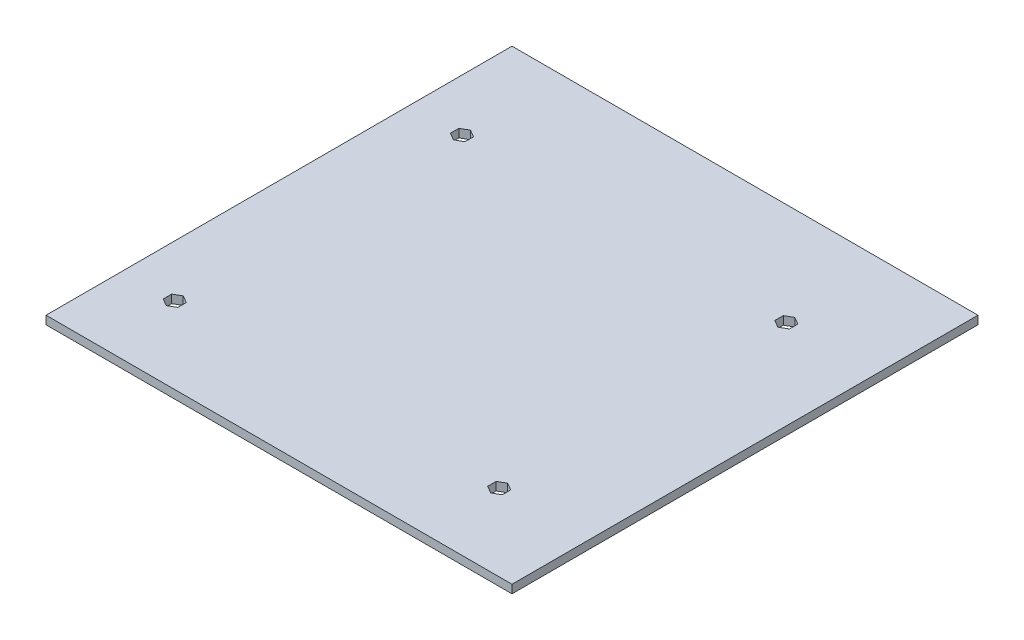
ISO-10303-21;
HEADER;
FILE_DESCRIPTION(('STEP AP214'),'2;1');
FILE_NAME('part.step','',(''),(''),'','','');
FILE_SCHEMA(('AUTOMOTIVE_DESIGN { 1 0 10303 214 1 1 1 1 }'));
ENDSEC;
DATA;
#1=APPLICATION_CONTEXT('core data for automotive mechanical design processes');
#2=APPLICATION_PROTOCOL_DEFINITION('international standard','automotive_design',2000,#1);
#3=PRODUCT_CONTEXT('',#1,'mechanical');
#4=PRODUCT('Part','Part','',(#3));
#5=PRODUCT_RELATED_PRODUCT_CATEGORY('part','',(#4));
#6=PRODUCT_DEFINITION_FORMATION('','',#4);
#7=PRODUCT_DEFINITION_CONTEXT('part definition',#1,'design');
#8=PRODUCT_DEFINITION('design','',#6,#7);
#9=PRODUCT_DEFINITION_SHAPE('','',#8);
#10=(LENGTH_UNIT() NAMED_UNIT(*) SI_UNIT(.MILLI.,.METRE.));
#11=(NAMED_UNIT(*) PLANE_ANGLE_UNIT() SI_UNIT($,.RADIAN.));
#12=(NAMED_UNIT(*) SI_UNIT($,.STERADIAN.) SOLID_ANGLE_UNIT());
#13=UNCERTAINTY_MEASURE_WITH_UNIT(LENGTH_MEASURE(1.E-05),#10,'distance_accuracy_value','');
#14=(GEOMETRIC_REPRESENTATION_CONTEXT(3) GLOBAL_UNCERTAINTY_ASSIGNED_CONTEXT((#13)) GLOBAL_UNIT_ASSIGNED_CONTEXT((#10,
#11,#12)) REPRESENTATION_CONTEXT('',''));
#15=CARTESIAN_POINT('',(0.,0.,0.));
#16=DIRECTION('',(0.,0.,1.));
#17=DIRECTION('',(1.,0.,0.));
#18=AXIS2_PLACEMENT_3D('',#15,#16,#17);
#19=CARTESIAN_POINT('',(-75.972706935123,3.175,110.776957494407));
#20=DIRECTION('',(1.,0.,0.));
#21=DIRECTION('',(0.,0.,-1.));
#22=AXIS2_PLACEMENT_3D('',#19,#20,#21);
#23=PLANE('',#22);
#24=DIRECTION('',(0.,0.,1.));
#25=VECTOR('',#24,1.);
#26=CARTESIAN_POINT('',(-75.972706935123,0.,110.776957494407));
#27=LINE('',#26,#25);
#28=CARTESIAN_POINT('',(-75.972706935123,0.,-67.0230425055928));
#29=VERTEX_POINT('',#28);
#30=CARTESIAN_POINT('',(-75.972706935123,0.,110.776957494407));
#31=VERTEX_POINT('',#30);
#32=EDGE_CURVE('E479',#29,#31,#27,.T.);
#33=ORIENTED_EDGE('',*,*,#32,.T.);
#34=DIRECTION('',(0.,-1.,0.));
#35=VECTOR('',#34,1.);
#36=CARTESIAN_POINT('',(-75.972706935123,3.175,110.776957494407));
#37=LINE('',#36,#35);
#38=CARTESIAN_POINT('',(-75.972706935123,3.175,110.776957494407));
#39=VERTEX_POINT('',#38);
#40=EDGE_CURVE('E11',#39,#31,#37,.T.);
#41=ORIENTED_EDGE('',*,*,#40,.F.);
#42=DIRECTION('',(0.,0.,1.));
#43=VECTOR('',#42,1.);
#44=CARTESIAN_POINT('',(-75.972706935123,3.175,110.776957494407));
#45=LINE('',#44,#43);
#46=CARTESIAN_POINT('',(-75.972706935123,3.175,-67.0230425055928));
#47=VERTEX_POINT('',#46);
#48=EDGE_CURVE('E495',#47,#39,#45,.T.);
#49=ORIENTED_EDGE('',*,*,#48,.F.);
#50=DIRECTION('',(0.,-1.,0.));
#51=VECTOR('',#50,1.);
#52=CARTESIAN_POINT('',(-75.972706935123,3.175,-67.0230425055928));
#53=LINE('',#52,#51);
#54=EDGE_CURVE('E509',#47,#29,#53,.T.);
#55=ORIENTED_EDGE('',*,*,#54,.T.);
#56=EDGE_LOOP('',(#33,#41,#49,#55));
#57=FACE_BOUND('',#56,.T.);
#58=ADVANCED_FACE('F38',(#57),#23,.F.);
#59=CARTESIAN_POINT('',(-75.972706935123,3.175,110.776957494407));
#60=DIRECTION('',(0.,0.,-1.));
#61=DIRECTION('',(-1.,0.,0.));
#62=AXIS2_PLACEMENT_3D('',#59,#60,#61);
#63=PLANE('',#62);
#64=DIRECTION('',(1.,0.,0.));
#65=VECTOR('',#64,1.);
#66=CARTESIAN_POINT('',(-75.972706935123,0.,110.776957494407));
#67=LINE('',#66,#65);
#68=CARTESIAN_POINT('',(101.827293064877,0.,110.776957494407));
#69=VERTEX_POINT('',#68);
#70=EDGE_CURVE('E513',#31,#69,#67,.T.);
#71=ORIENTED_EDGE('',*,*,#70,.T.);
#72=DIRECTION('',(0.,-1.,0.));
#73=VECTOR('',#72,1.);
#74=CARTESIAN_POINT('',(101.827293064877,3.175,110.776957494407));
#75=LINE('',#74,#73);
#76=CARTESIAN_POINT('',(101.827293064877,3.175,110.776957494407));
#77=VERTEX_POINT('',#76);
#78=EDGE_CURVE('E46',#77,#69,#75,.T.);
#79=ORIENTED_EDGE('',*,*,#78,.F.);
#80=DIRECTION('',(1.,0.,0.));
#81=VECTOR('',#80,1.);
#82=CARTESIAN_POINT('',(-75.972706935123,3.175,110.776957494407));
#83=LINE('',#82,#81);
#84=EDGE_CURVE('E499',#39,#77,#83,.T.);
#85=ORIENTED_EDGE('',*,*,#84,.F.);
#86=ORIENTED_EDGE('',*,*,#40,.T.);
#87=EDGE_LOOP('',(#71,#79,#85,#86));
#88=FACE_BOUND('',#87,.T.);
#89=ADVANCED_FACE('F548',(#88),#63,.F.);
#90=CARTESIAN_POINT('',(101.827293064877,3.175,110.776957494407));
#91=DIRECTION('',(-1.,0.,0.));
#92=DIRECTION('',(0.,0.,1.));
#93=AXIS2_PLACEMENT_3D('',#90,#91,#92);
#94=PLANE('',#93);
#95=DIRECTION('',(0.,0.,-1.));
#96=VECTOR('',#95,1.);
#97=CARTESIAN_POINT('',(101.827293064877,0.,110.776957494407));
#98=LINE('',#97,#96);
#99=CARTESIAN_POINT('',(101.827293064877,0.,-67.0230425055928));
#100=VERTEX_POINT('',#99);
#101=EDGE_CURVE('E516',#69,#100,#98,.T.);
#102=ORIENTED_EDGE('',*,*,#101,.T.);
#103=DIRECTION('',(0.,-1.,0.));
#104=VECTOR('',#103,1.);
#105=CARTESIAN_POINT('',(101.827293064877,3.175,-67.0230425055928));
#106=LINE('',#105,#104);
#107=CARTESIAN_POINT('',(101.827293064877,3.175,-67.0230425055928));
#108=VERTEX_POINT('',#107);
#109=EDGE_CURVE('E524',#108,#100,#106,.T.);
#110=ORIENTED_EDGE('',*,*,#109,.F.);
#111=DIRECTION('',(0.,0.,-1.));
#112=VECTOR('',#111,1.);
#113=CARTESIAN_POINT('',(101.827293064877,3.175,110.776957494407));
#114=LINE('',#113,#112);
#115=EDGE_CURVE('E503',#77,#108,#114,.T.);
#116=ORIENTED_EDGE('',*,*,#115,.F.);
#117=ORIENTED_EDGE('',*,*,#78,.T.);
#118=EDGE_LOOP('',(#102,#110,#116,#117));
#119=FACE_BOUND('',#118,.T.);
#120=ADVANCED_FACE('F533',(#119),#94,.F.);
#121=CARTESIAN_POINT('',(-75.972706935123,3.175,-67.0230425055928));
#122=DIRECTION('',(0.,0.,1.));
#123=DIRECTION('',(1.,0.,0.));
#124=AXIS2_PLACEMENT_3D('',#121,#122,#123);
#125=PLANE('',#124);
#126=DIRECTION('',(-1.,0.,0.));
#127=VECTOR('',#126,1.);
#128=CARTESIAN_POINT('',(-75.972706935123,0.,-67.0230425055928));
#129=LINE('',#128,#127);
#130=EDGE_CURVE('E500',#100,#29,#129,.T.);
#131=ORIENTED_EDGE('',*,*,#130,.T.);
#132=ORIENTED_EDGE('',*,*,#54,.F.);
#133=DIRECTION('',(-1.,0.,0.));
#134=VECTOR('',#133,1.);
#135=CARTESIAN_POINT('',(-75.972706935123,3.175,-67.0230425055928));
#136=LINE('',#135,#134);
#137=EDGE_CURVE('E506',#108,#47,#136,.T.);
#138=ORIENTED_EDGE('',*,*,#137,.F.);
#139=ORIENTED_EDGE('',*,*,#109,.T.);
#140=EDGE_LOOP('',(#131,#132,#138,#139));
#141=FACE_BOUND('',#140,.T.);
#142=ADVANCED_FACE('F541',(#141),#125,.F.);
#143=CARTESIAN_POINT('',(0.,3.175,0.));
#144=DIRECTION('',(0.,-1.,0.));
#145=DIRECTION('',(0.,0.,-1.));
#146=AXIS2_PLACEMENT_3D('',#143,#144,#145);
#147=PLANE('',#146);
#148=DIRECTION('',(-0.866025403784439,0.,0.5));
#149=VECTOR('',#148,1.);
#150=CARTESIAN_POINT('',(67.6104569627221,3.175,-31.3426112365452));
#151=LINE('',#150,#149);
#152=CARTESIAN_POINT('',(67.6104569627221,3.175,-31.3426112365452));
#153=VERTEX_POINT('',#152);
#154=CARTESIAN_POINT('',(64.8164569627221,3.175,-29.7294945844294));
#155=VERTEX_POINT('',#154);
#156=EDGE_CURVE('E328',#153,#155,#151,.T.);
#157=ORIENTED_EDGE('',*,*,#156,.F.);
#158=DIRECTION('',(-0.866025403784439,0.,-0.499999999999999));
#159=VECTOR('',#158,1.);
#160=CARTESIAN_POINT('',(70.4044569627222,3.175,-29.7294945844294));
#161=LINE('',#160,#159);
#162=CARTESIAN_POINT('',(70.4044569627222,3.175,-29.7294945844294));
#163=VERTEX_POINT('',#162);
#164=EDGE_CURVE('E53',#163,#153,#161,.T.);
#165=ORIENTED_EDGE('',*,*,#164,.F.);
#166=DIRECTION('',(0.,0.,-1.));
#167=VECTOR('',#166,1.);
#168=CARTESIAN_POINT('',(70.4044569627222,3.175,-26.5032612801977));
#169=LINE('',#168,#167);
#170=CARTESIAN_POINT('',(70.4044569627222,3.175,-26.5032612801977));
#171=VERTEX_POINT('',#170);
#172=EDGE_CURVE('E305',#171,#163,#169,.T.);
#173=ORIENTED_EDGE('',*,*,#172,.F.);
#174=DIRECTION('',(0.866025403784439,0.,-0.5));
#175=VECTOR('',#174,1.);
#176=CARTESIAN_POINT('',(67.6104569627222,3.175,-24.8901446280819));
#177=LINE('',#176,#175);
#178=CARTESIAN_POINT('',(67.6104569627222,3.175,-24.8901446280819));
#179=VERTEX_POINT('',#178);
#180=EDGE_CURVE('E341',#179,#171,#177,.T.);
#181=ORIENTED_EDGE('',*,*,#180,.F.);
#182=DIRECTION('',(0.866025403784439,0.,0.499999999999999));
#183=VECTOR('',#182,1.);
#184=CARTESIAN_POINT('',(64.8164569627221,3.175,-26.5032612801978));
#185=LINE('',#184,#183);
#186=CARTESIAN_POINT('',(64.8164569627221,3.175,-26.5032612801978));
#187=VERTEX_POINT('',#186);
#188=EDGE_CURVE('E337',#187,#179,#185,.T.);
#189=ORIENTED_EDGE('',*,*,#188,.F.);
#190=DIRECTION('',(0.,0.,1.));
#191=VECTOR('',#190,1.);
#192=CARTESIAN_POINT('',(64.8164569627221,3.175,-29.7294945844294));
#193=LINE('',#192,#191);
#194=EDGE_CURVE('E333',#155,#187,#193,.T.);
#195=ORIENTED_EDGE('',*,*,#194,.F.);
#196=EDGE_LOOP('',(#157,#165,#173,#181,#189,#195));
#197=FACE_BOUND('',#196,.T.);
#198=DIRECTION('',(-0.86602540378444,0.,0.499999999999998));
#199=VECTOR('',#198,1.);
#200=CARTESIAN_POINT('',(-56.1856971312266,3.175,78.2144937021672));
#201=LINE('',#200,#199);
#202=CARTESIAN_POINT('',(-56.1856971312266,3.175,78.2144937021672));
#203=VERTEX_POINT('',#202);
#204=CARTESIAN_POINT('',(-58.9796971312266,3.175,79.827610354283));
#205=VERTEX_POINT('',#204);
#206=EDGE_CURVE('E394',#203,#205,#201,.T.);
#207=ORIENTED_EDGE('',*,*,#206,.F.);
#208=DIRECTION('',(-0.86602540378444,0.,-0.499999999999998));
#209=VECTOR('',#208,1.);
#210=CARTESIAN_POINT('',(-53.3916971312266,3.175,79.827610354283));
#211=LINE('',#210,#209);
#212=CARTESIAN_POINT('',(-53.3916971312266,3.175,79.827610354283));
#213=VERTEX_POINT('',#212);
#214=EDGE_CURVE('E61',#213,#203,#211,.T.);
#215=ORIENTED_EDGE('',*,*,#214,.F.);
#216=DIRECTION('',(0.,0.,-1.));
#217=VECTOR('',#216,1.);
#218=CARTESIAN_POINT('',(-53.3916971312266,3.175,83.0538436585147));
#219=LINE('',#218,#217);
#220=CARTESIAN_POINT('',(-53.3916971312266,3.175,83.0538436585147));
#221=VERTEX_POINT('',#220);
#222=EDGE_CURVE('E371',#221,#213,#219,.T.);
#223=ORIENTED_EDGE('',*,*,#222,.F.);
#224=DIRECTION('',(0.866025403784438,0.,-0.500000000000002));
#225=VECTOR('',#224,1.);
#226=CARTESIAN_POINT('',(-56.1856971312266,3.175,84.6669603106305));
#227=LINE('',#226,#225);
#228=CARTESIAN_POINT('',(-56.1856971312266,3.175,84.6669603106305));
#229=VERTEX_POINT('',#228);
#230=EDGE_CURVE('E406',#229,#221,#227,.T.);
#231=ORIENTED_EDGE('',*,*,#230,.F.);
#232=DIRECTION('',(0.866025403784439,0.,0.5));
#233=VECTOR('',#232,1.);
#234=CARTESIAN_POINT('',(-58.9796971312266,3.175,83.0538436585147));
#235=LINE('',#234,#233);
#236=CARTESIAN_POINT('',(-58.9796971312266,3.175,83.0538436585147));
#237=VERTEX_POINT('',#236);
#238=EDGE_CURVE('E402',#237,#229,#235,.T.);
#239=ORIENTED_EDGE('',*,*,#238,.F.);
#240=DIRECTION('',(0.,0.,1.));
#241=VECTOR('',#240,1.);
#242=CARTESIAN_POINT('',(-58.9796971312266,3.175,79.827610354283));
#243=LINE('',#242,#241);
#244=EDGE_CURVE('E398',#205,#237,#243,.T.);
#245=ORIENTED_EDGE('',*,*,#244,.F.);
#246=EDGE_LOOP('',(#207,#215,#223,#231,#239,#245));
#247=FACE_BOUND('',#246,.T.);
#248=DIRECTION('',(-0.866025403784439,0.,0.499999999999999));
#249=VECTOR('',#248,1.);
#250=CARTESIAN_POINT('',(67.610393763033,3.175,78.2144937021672));
#251=LINE('',#250,#249);
#252=CARTESIAN_POINT('',(67.610393763033,3.175,78.2144937021672));
#253=VERTEX_POINT('',#252);
#254=CARTESIAN_POINT('',(64.816393763033,3.175,79.827610354283));
#255=VERTEX_POINT('',#254);
#256=EDGE_CURVE('E272',#253,#255,#251,.T.);
#257=ORIENTED_EDGE('',*,*,#256,.F.);
#258=DIRECTION('',(-0.866025403784439,0.,-0.499999999999999));
#259=VECTOR('',#258,1.);
#260=CARTESIAN_POINT('',(70.404393763033,3.175,79.827610354283));
#261=LINE('',#260,#259);
#262=CARTESIAN_POINT('',(70.404393763033,3.175,79.827610354283));
#263=VERTEX_POINT('',#262);
#264=EDGE_CURVE('E230',#263,#253,#261,.T.);
#265=ORIENTED_EDGE('',*,*,#264,.F.);
#266=DIRECTION('',(0.,0.,-1.));
#267=VECTOR('',#266,1.);
#268=CARTESIAN_POINT('',(70.404393763033,3.175,83.0538436585146));
#269=LINE('',#268,#267);
#270=CARTESIAN_POINT('',(70.404393763033,3.175,83.0538436585146));
#271=VERTEX_POINT('',#270);
#272=EDGE_CURVE('E252',#271,#263,#269,.T.);
#273=ORIENTED_EDGE('',*,*,#272,.F.);
#274=DIRECTION('',(0.866025403784439,0.,-0.499999999999999));
#275=VECTOR('',#274,1.);
#276=CARTESIAN_POINT('',(67.610393763033,3.175,84.6669603106304));
#277=LINE('',#276,#275);
#278=CARTESIAN_POINT('',(67.610393763033,3.175,84.6669603106304));
#279=VERTEX_POINT('',#278);
#280=EDGE_CURVE('E256',#279,#271,#277,.T.);
#281=ORIENTED_EDGE('',*,*,#280,.F.);
#282=DIRECTION('',(0.866025403784439,0.,0.499999999999999));
#283=VECTOR('',#282,1.);
#284=CARTESIAN_POINT('',(64.816393763033,3.175,83.0538436585146));
#285=LINE('',#284,#283);
#286=CARTESIAN_POINT('',(64.816393763033,3.175,83.0538436585146));
#287=VERTEX_POINT('',#286);
#288=EDGE_CURVE('E279',#287,#279,#285,.T.);
#289=ORIENTED_EDGE('',*,*,#288,.F.);
#290=DIRECTION('',(0.,0.,1.));
#291=VECTOR('',#290,1.);
#292=CARTESIAN_POINT('',(64.816393763033,3.175,79.827610354283));
#293=LINE('',#292,#291);
#294=EDGE_CURVE('E275',#255,#287,#293,.T.);
#295=ORIENTED_EDGE('',*,*,#294,.F.);
#296=EDGE_LOOP('',(#257,#265,#273,#281,#289,#295));
#297=FACE_BOUND('',#296,.T.);
#298=DIRECTION('',(-0.00951194551285763,0.,0.999954760422971));
#299=VECTOR('',#298,1.);
#300=CARTESIAN_POINT('',(-58.933539098746,3.175,-29.7561074485498));
#301=LINE('',#300,#299);
#302=CARTESIAN_POINT('',(-58.933539098746,3.175,-29.7561074485498));
#303=VERTEX_POINT('',#302);
#304=CARTESIAN_POINT('',(-58.9642268541476,3.175,-26.5300200977483));
#305=VERTEX_POINT('',#304);
#306=EDGE_CURVE('E457',#303,#305,#301,.T.);
#307=ORIENTED_EDGE('',*,*,#306,.F.);
#308=DIRECTION('',(-0.870742197917903,0.,0.491739793757937));
#309=VECTOR('',#308,1.);
#310=CARTESIAN_POINT('',(-56.1243216204234,3.175,-31.3425747481877));
#311=LINE('',#310,#309);
#312=CARTESIAN_POINT('',(-56.1243216204234,3.175,-31.3425747481877));
#313=VERTEX_POINT('',#312);
#314=EDGE_CURVE('E351',#313,#303,#311,.T.);
#315=ORIENTED_EDGE('',*,*,#314,.F.);
#316=DIRECTION('',(-0.861230252405049,0.,-0.508214966665028));
#317=VECTOR('',#316,1.);
#318=CARTESIAN_POINT('',(-53.3457918975024,3.175,-29.702954697024));
#319=LINE('',#318,#317);
#320=CARTESIAN_POINT('',(-53.3457918975024,3.175,-29.702954697024));
#321=VERTEX_POINT('',#320);
#322=EDGE_CURVE('E434',#321,#313,#319,.T.);
#323=ORIENTED_EDGE('',*,*,#322,.F.);
#324=DIRECTION('',(0.00951194551286408,0.,-0.999954760422971));
#325=VECTOR('',#324,1.);
#326=CARTESIAN_POINT('',(-53.3764796529041,3.175,-26.4768673462224));
#327=LINE('',#326,#325);
#328=CARTESIAN_POINT('',(-53.3764796529041,3.175,-26.4768673462224));
#329=VERTEX_POINT('',#328);
#330=EDGE_CURVE('E469',#329,#321,#327,.T.);
#331=ORIENTED_EDGE('',*,*,#330,.F.);
#332=DIRECTION('',(0.870742197917904,0.,-0.491739793757937));
#333=VECTOR('',#332,1.);
#334=CARTESIAN_POINT('',(-56.1856971312266,3.175,-24.8904000465846));
#335=LINE('',#334,#333);
#336=CARTESIAN_POINT('',(-56.1856971312266,3.175,-24.8904000465846));
#337=VERTEX_POINT('',#336);
#338=EDGE_CURVE('E465',#337,#329,#335,.T.);
#339=ORIENTED_EDGE('',*,*,#338,.F.);
#340=DIRECTION('',(0.861230252405046,0.,0.508214966665033));
#341=VECTOR('',#340,1.);
#342=CARTESIAN_POINT('',(-58.9642268541476,3.175,-26.5300200977483));
#343=LINE('',#342,#341);
#344=EDGE_CURVE('E461',#305,#337,#343,.T.);
#345=ORIENTED_EDGE('',*,*,#344,.F.);
#346=EDGE_LOOP('',(#307,#315,#323,#331,#339,#345));
#347=FACE_BOUND('',#346,.T.);
#348=ORIENTED_EDGE('',*,*,#48,.T.);
#349=ORIENTED_EDGE('',*,*,#84,.T.);
#350=ORIENTED_EDGE('',*,*,#115,.T.);
#351=ORIENTED_EDGE('',*,*,#137,.T.);
#352=EDGE_LOOP('',(#348,#349,#350,#351));
#353=FACE_BOUND('',#352,.T.);
#354=ADVANCED_FACE('F547',(#197,#247,#297,#347,#353),#147,.F.);
#355=CARTESIAN_POINT('',(0.,0.,0.));
#356=DIRECTION('',(0.,-1.,0.));
#357=DIRECTION('',(0.,0.,-1.));
#358=AXIS2_PLACEMENT_3D('',#355,#356,#357);
#359=PLANE('',#358);
#360=DIRECTION('',(-0.866025403784439,0.,-0.499999999999999));
#361=VECTOR('',#360,1.);
#362=CARTESIAN_POINT('',(70.4044569627222,0.,-29.7294945844294));
#363=LINE('',#362,#361);
#364=CARTESIAN_POINT('',(70.4044569627222,0.,-29.7294945844294));
#365=VERTEX_POINT('',#364);
#366=CARTESIAN_POINT('',(67.6104569627221,0.,-31.3426112365452));
#367=VERTEX_POINT('',#366);
#368=EDGE_CURVE('E300',#365,#367,#363,.T.);
#369=ORIENTED_EDGE('',*,*,#368,.T.);
#370=DIRECTION('',(-0.866025403784439,0.,0.5));
#371=VECTOR('',#370,1.);
#372=CARTESIAN_POINT('',(67.6104569627221,0.,-31.3426112365452));
#373=LINE('',#372,#371);
#374=CARTESIAN_POINT('',(64.8164569627221,0.,-29.7294945844294));
#375=VERTEX_POINT('',#374);
#376=EDGE_CURVE('E304',#367,#375,#373,.T.);
#377=ORIENTED_EDGE('',*,*,#376,.T.);
#378=DIRECTION('',(0.,0.,1.));
#379=VECTOR('',#378,1.);
#380=CARTESIAN_POINT('',(64.8164569627221,0.,-29.7294945844294));
#381=LINE('',#380,#379);
#382=CARTESIAN_POINT('',(64.8164569627221,0.,-26.5032612801978));
#383=VERTEX_POINT('',#382);
#384=EDGE_CURVE('E309',#375,#383,#381,.T.);
#385=ORIENTED_EDGE('',*,*,#384,.T.);
#386=DIRECTION('',(0.866025403784439,0.,0.499999999999999));
#387=VECTOR('',#386,1.);
#388=CARTESIAN_POINT('',(64.8164569627221,0.,-26.5032612801978));
#389=LINE('',#388,#387);
#390=CARTESIAN_POINT('',(67.6104569627222,0.,-24.8901446280819));
#391=VERTEX_POINT('',#390);
#392=EDGE_CURVE('E313',#383,#391,#389,.T.);
#393=ORIENTED_EDGE('',*,*,#392,.T.);
#394=DIRECTION('',(0.866025403784439,0.,-0.5));
#395=VECTOR('',#394,1.);
#396=CARTESIAN_POINT('',(67.6104569627222,0.,-24.8901446280819));
#397=LINE('',#396,#395);
#398=CARTESIAN_POINT('',(70.4044569627222,0.,-26.5032612801977));
#399=VERTEX_POINT('',#398);
#400=EDGE_CURVE('E317',#391,#399,#397,.T.);
#401=ORIENTED_EDGE('',*,*,#400,.T.);
#402=DIRECTION('',(0.,0.,-1.));
#403=VECTOR('',#402,1.);
#404=CARTESIAN_POINT('',(70.4044569627222,0.,-26.5032612801977));
#405=LINE('',#404,#403);
#406=EDGE_CURVE('E321',#399,#365,#405,.T.);
#407=ORIENTED_EDGE('',*,*,#406,.T.);
#408=EDGE_LOOP('',(#369,#377,#385,#393,#401,#407));
#409=FACE_BOUND('',#408,.T.);
#410=DIRECTION('',(-0.86602540378444,0.,-0.499999999999998));
#411=VECTOR('',#410,1.);
#412=CARTESIAN_POINT('',(-53.3916971312266,0.,79.827610354283));
#413=LINE('',#412,#411);
#414=CARTESIAN_POINT('',(-53.3916971312266,0.,79.827610354283));
#415=VERTEX_POINT('',#414);
#416=CARTESIAN_POINT('',(-56.1856971312266,0.,78.2144937021672));
#417=VERTEX_POINT('',#416);
#418=EDGE_CURVE('E366',#415,#417,#413,.T.);
#419=ORIENTED_EDGE('',*,*,#418,.T.);
#420=DIRECTION('',(-0.86602540378444,0.,0.499999999999998));
#421=VECTOR('',#420,1.);
#422=CARTESIAN_POINT('',(-56.1856971312266,0.,78.2144937021672));
#423=LINE('',#422,#421);
#424=CARTESIAN_POINT('',(-58.9796971312267,0.,79.827610354283));
#425=VERTEX_POINT('',#424);
#426=EDGE_CURVE('E370',#417,#425,#423,.T.);
#427=ORIENTED_EDGE('',*,*,#426,.T.);
#428=DIRECTION('',(0.,0.,1.));
#429=VECTOR('',#428,1.);
#430=CARTESIAN_POINT('',(-58.9796971312266,0.,79.827610354283));
#431=LINE('',#430,#429);
#432=CARTESIAN_POINT('',(-58.9796971312266,0.,83.0538436585147));
#433=VERTEX_POINT('',#432);
#434=EDGE_CURVE('E375',#425,#433,#431,.T.);
#435=ORIENTED_EDGE('',*,*,#434,.T.);
#436=DIRECTION('',(0.866025403784439,0.,0.5));
#437=VECTOR('',#436,1.);
#438=CARTESIAN_POINT('',(-58.9796971312266,0.,83.0538436585147));
#439=LINE('',#438,#437);
#440=CARTESIAN_POINT('',(-56.1856971312266,0.,84.6669603106305));
#441=VERTEX_POINT('',#440);
#442=EDGE_CURVE('E379',#433,#441,#439,.T.);
#443=ORIENTED_EDGE('',*,*,#442,.T.);
#444=DIRECTION('',(0.866025403784438,0.,-0.500000000000002));
#445=VECTOR('',#444,1.);
#446=CARTESIAN_POINT('',(-56.1856971312266,0.,84.6669603106305));
#447=LINE('',#446,#445);
#448=CARTESIAN_POINT('',(-53.3916971312266,0.,83.0538436585147));
#449=VERTEX_POINT('',#448);
#450=EDGE_CURVE('E383',#441,#449,#447,.T.);
#451=ORIENTED_EDGE('',*,*,#450,.T.);
#452=DIRECTION('',(0.,0.,-1.));
#453=VECTOR('',#452,1.);
#454=CARTESIAN_POINT('',(-53.3916971312266,0.,83.0538436585147));
#455=LINE('',#454,#453);
#456=EDGE_CURVE('E387',#449,#415,#455,.T.);
#457=ORIENTED_EDGE('',*,*,#456,.T.);
#458=EDGE_LOOP('',(#419,#427,#435,#443,#451,#457));
#459=FACE_BOUND('',#458,.T.);
#460=DIRECTION('',(-0.866025403784439,0.,-0.499999999999999));
#461=VECTOR('',#460,1.);
#462=CARTESIAN_POINT('',(70.404393763033,0.,79.827610354283));
#463=LINE('',#462,#461);
#464=CARTESIAN_POINT('',(70.404393763033,0.,79.827610354283));
#465=VERTEX_POINT('',#464);
#466=CARTESIAN_POINT('',(67.610393763033,0.,78.2144937021672));
#467=VERTEX_POINT('',#466);
#468=EDGE_CURVE('E227',#465,#467,#463,.T.);
#469=ORIENTED_EDGE('',*,*,#468,.T.);
#470=DIRECTION('',(-0.866025403784439,0.,0.499999999999999));
#471=VECTOR('',#470,1.);
#472=CARTESIAN_POINT('',(67.610393763033,0.,78.2144937021672));
#473=LINE('',#472,#471);
#474=CARTESIAN_POINT('',(64.816393763033,0.,79.827610354283));
#475=VERTEX_POINT('',#474);
#476=EDGE_CURVE('E240',#467,#475,#473,.T.);
#477=ORIENTED_EDGE('',*,*,#476,.T.);
#478=DIRECTION('',(0.,0.,1.));
#479=VECTOR('',#478,1.);
#480=CARTESIAN_POINT('',(64.816393763033,0.,79.827610354283));
#481=LINE('',#480,#479);
#482=CARTESIAN_POINT('',(64.816393763033,0.,83.0538436585146));
#483=VERTEX_POINT('',#482);
#484=EDGE_CURVE('E245',#475,#483,#481,.T.);
#485=ORIENTED_EDGE('',*,*,#484,.T.);
#486=DIRECTION('',(0.866025403784439,0.,0.499999999999999));
#487=VECTOR('',#486,1.);
#488=CARTESIAN_POINT('',(64.816393763033,0.,83.0538436585146));
#489=LINE('',#488,#487);
#490=CARTESIAN_POINT('',(67.610393763033,0.,84.6669603106304));
#491=VERTEX_POINT('',#490);
#492=EDGE_CURVE('E261',#483,#491,#489,.T.);
#493=ORIENTED_EDGE('',*,*,#492,.T.);
#494=DIRECTION('',(0.866025403784439,0.,-0.499999999999999));
#495=VECTOR('',#494,1.);
#496=CARTESIAN_POINT('',(67.610393763033,0.,84.6669603106304));
#497=LINE('',#496,#495);
#498=CARTESIAN_POINT('',(70.404393763033,0.,83.0538436585146));
#499=VERTEX_POINT('',#498);
#500=EDGE_CURVE('E265',#491,#499,#497,.T.);
#501=ORIENTED_EDGE('',*,*,#500,.T.);
#502=DIRECTION('',(0.,0.,-1.));
#503=VECTOR('',#502,1.);
#504=CARTESIAN_POINT('',(70.404393763033,0.,83.0538436585146));
#505=LINE('',#504,#503);
#506=EDGE_CURVE('E236',#499,#465,#505,.T.);
#507=ORIENTED_EDGE('',*,*,#506,.T.);
#508=EDGE_LOOP('',(#469,#477,#485,#493,#501,#507));
#509=FACE_BOUND('',#508,.T.);
#510=DIRECTION('',(-0.870742197917903,0.,0.491739793757937));
#511=VECTOR('',#510,1.);
#512=CARTESIAN_POINT('',(-56.1243216204234,0.,-31.3425747481877));
#513=LINE('',#512,#511);
#514=CARTESIAN_POINT('',(-56.1243216204234,0.,-31.3425747481877));
#515=VERTEX_POINT('',#514);
#516=CARTESIAN_POINT('',(-58.933539098746,0.,-29.7561074485498));
#517=VERTEX_POINT('',#516);
#518=EDGE_CURVE('E429',#515,#517,#513,.T.);
#519=ORIENTED_EDGE('',*,*,#518,.T.);
#520=DIRECTION('',(-0.00951194551285763,0.,0.999954760422971));
#521=VECTOR('',#520,1.);
#522=CARTESIAN_POINT('',(-58.933539098746,0.,-29.7561074485498));
#523=LINE('',#522,#521);
#524=CARTESIAN_POINT('',(-58.9642268541476,0.,-26.5300200977483));
#525=VERTEX_POINT('',#524);
#526=EDGE_CURVE('E433',#517,#525,#523,.T.);
#527=ORIENTED_EDGE('',*,*,#526,.T.);
#528=DIRECTION('',(0.861230252405046,0.,0.508214966665033));
#529=VECTOR('',#528,1.);
#530=CARTESIAN_POINT('',(-58.9642268541476,0.,-26.5300200977483));
#531=LINE('',#530,#529);
#532=CARTESIAN_POINT('',(-56.1856971312266,0.,-24.8904000465846));
#533=VERTEX_POINT('',#532);
#534=EDGE_CURVE('E438',#525,#533,#531,.T.);
#535=ORIENTED_EDGE('',*,*,#534,.T.);
#536=DIRECTION('',(0.870742197917904,0.,-0.491739793757937));
#537=VECTOR('',#536,1.);
#538=CARTESIAN_POINT('',(-56.1856971312266,0.,-24.8904000465846));
#539=LINE('',#538,#537);
#540=CARTESIAN_POINT('',(-53.3764796529041,0.,-26.4768673462224));
#541=VERTEX_POINT('',#540);
#542=EDGE_CURVE('E442',#533,#541,#539,.T.);
#543=ORIENTED_EDGE('',*,*,#542,.T.);
#544=DIRECTION('',(0.00951194551286408,0.,-0.999954760422971));
#545=VECTOR('',#544,1.);
#546=CARTESIAN_POINT('',(-53.3764796529041,0.,-26.4768673462224));
#547=LINE('',#546,#545);
#548=CARTESIAN_POINT('',(-53.3457918975024,0.,-29.702954697024));
#549=VERTEX_POINT('',#548);
#550=EDGE_CURVE('E446',#541,#549,#547,.T.);
#551=ORIENTED_EDGE('',*,*,#550,.T.);
#552=DIRECTION('',(-0.861230252405049,0.,-0.508214966665028));
#553=VECTOR('',#552,1.);
#554=CARTESIAN_POINT('',(-53.3457918975024,0.,-29.702954697024));
#555=LINE('',#554,#553);
#556=EDGE_CURVE('E450',#549,#515,#555,.T.);
#557=ORIENTED_EDGE('',*,*,#556,.T.);
#558=EDGE_LOOP('',(#519,#527,#535,#543,#551,#557));
#559=FACE_BOUND('',#558,.T.);
#560=ORIENTED_EDGE('',*,*,#32,.F.);
#561=ORIENTED_EDGE('',*,*,#130,.F.);
#562=ORIENTED_EDGE('',*,*,#101,.F.);
#563=ORIENTED_EDGE('',*,*,#70,.F.);
#564=EDGE_LOOP('',(#560,#561,#562,#563));
#565=FACE_BOUND('',#564,.T.);
#566=ADVANCED_FACE('F247',(#409,#459,#509,#559,#565),#359,.T.);
#567=CARTESIAN_POINT('',(-56.1243216204234,0.,-31.3425747481877));
#568=DIRECTION('',(-0.491739793757937,0.,-0.870742197917903));
#569=DIRECTION('',(-0.870742197917904,0.,0.491739793757937));
#570=AXIS2_PLACEMENT_3D('',#567,#568,#569);
#571=PLANE('',#570);
#572=ORIENTED_EDGE('',*,*,#314,.T.);
#573=DIRECTION('',(0.,1.,0.));
#574=VECTOR('',#573,1.);
#575=CARTESIAN_POINT('',(-58.933539098746,0.,-29.7561074485498));
#576=LINE('',#575,#574);
#577=EDGE_CURVE('E454',#517,#303,#576,.T.);
#578=ORIENTED_EDGE('',*,*,#577,.F.);
#579=ORIENTED_EDGE('',*,*,#518,.F.);
#580=DIRECTION('',(0.,1.,0.));
#581=VECTOR('',#580,1.);
#582=CARTESIAN_POINT('',(-56.1243216204234,0.,-31.3425747481877));
#583=LINE('',#582,#581);
#584=EDGE_CURVE('E476',#515,#313,#583,.T.);
#585=ORIENTED_EDGE('',*,*,#584,.T.);
#586=EDGE_LOOP('',(#572,#578,#579,#585));
#587=FACE_BOUND('',#586,.T.);
#588=ADVANCED_FACE('F560',(#587),#571,.F.);
#589=CARTESIAN_POINT('',(-53.3457918975024,0.,-29.702954697024));
#590=DIRECTION('',(0.508214966665028,0.,-0.861230252405049));
#591=DIRECTION('',(-0.861230252405049,0.,-0.508214966665028));
#592=AXIS2_PLACEMENT_3D('',#589,#590,#591);
#593=PLANE('',#592);
#594=ORIENTED_EDGE('',*,*,#322,.T.);
#595=ORIENTED_EDGE('',*,*,#584,.F.);
#596=ORIENTED_EDGE('',*,*,#556,.F.);
#597=DIRECTION('',(0.,1.,0.));
#598=VECTOR('',#597,1.);
#599=CARTESIAN_POINT('',(-53.3457918975024,0.,-29.702954697024));
#600=LINE('',#599,#598);
#601=EDGE_CURVE('E480',#549,#321,#600,.T.);
#602=ORIENTED_EDGE('',*,*,#601,.T.);
#603=EDGE_LOOP('',(#594,#595,#596,#602));
#604=FACE_BOUND('',#603,.T.);
#605=ADVANCED_FACE('F567',(#604),#593,.F.);
#606=CARTESIAN_POINT('',(-53.3764796529041,0.,-26.4768673462224));
#607=DIRECTION('',(0.99995476042297,0.,0.00951194551286408));
#608=DIRECTION('',(0.00951194551286408,0.,-0.999954760422971));
#609=AXIS2_PLACEMENT_3D('',#606,#607,#608);
#610=PLANE('',#609);
#611=ORIENTED_EDGE('',*,*,#330,.T.);
#612=ORIENTED_EDGE('',*,*,#601,.F.);
#613=ORIENTED_EDGE('',*,*,#550,.F.);
#614=DIRECTION('',(0.,1.,0.));
#615=VECTOR('',#614,1.);
#616=CARTESIAN_POINT('',(-53.3764796529041,0.,-26.4768673462224));
#617=LINE('',#616,#615);
#618=EDGE_CURVE('E483',#541,#329,#617,.T.);
#619=ORIENTED_EDGE('',*,*,#618,.T.);
#620=EDGE_LOOP('',(#611,#612,#613,#619));
#621=FACE_BOUND('',#620,.T.);
#622=ADVANCED_FACE('F580',(#621),#610,.F.);
#623=CARTESIAN_POINT('',(-56.1856971312266,0.,-24.8904000465846));
#624=DIRECTION('',(0.491739793757937,0.,0.870742197917904));
#625=DIRECTION('',(0.870742197917904,0.,-0.491739793757937));
#626=AXIS2_PLACEMENT_3D('',#623,#624,#625);
#627=PLANE('',#626);
#628=ORIENTED_EDGE('',*,*,#338,.T.);
#629=ORIENTED_EDGE('',*,*,#618,.F.);
#630=ORIENTED_EDGE('',*,*,#542,.F.);
#631=DIRECTION('',(0.,1.,0.));
#632=VECTOR('',#631,1.);
#633=CARTESIAN_POINT('',(-56.1856971312266,0.,-24.8904000465846));
#634=LINE('',#633,#632);
#635=EDGE_CURVE('E486',#533,#337,#634,.T.);
#636=ORIENTED_EDGE('',*,*,#635,.T.);
#637=EDGE_LOOP('',(#628,#629,#630,#636));
#638=FACE_BOUND('',#637,.T.);
#639=ADVANCED_FACE('F576',(#638),#627,.F.);
#640=CARTESIAN_POINT('',(-58.9642268541476,0.,-26.5300200977483));
#641=DIRECTION('',(-0.508214966665033,0.,0.861230252405046));
#642=DIRECTION('',(0.861230252405046,0.,0.508214966665033));
#643=AXIS2_PLACEMENT_3D('',#640,#641,#642);
#644=PLANE('',#643);
#645=ORIENTED_EDGE('',*,*,#344,.T.);
#646=ORIENTED_EDGE('',*,*,#635,.F.);
#647=ORIENTED_EDGE('',*,*,#534,.F.);
#648=DIRECTION('',(0.,1.,0.));
#649=VECTOR('',#648,1.);
#650=CARTESIAN_POINT('',(-58.9642268541476,0.,-26.5300200977483));
#651=LINE('',#650,#649);
#652=EDGE_CURVE('E489',#525,#305,#651,.T.);
#653=ORIENTED_EDGE('',*,*,#652,.T.);
#654=EDGE_LOOP('',(#645,#646,#647,#653));
#655=FACE_BOUND('',#654,.T.);
#656=ADVANCED_FACE('F572',(#655),#644,.F.);
#657=CARTESIAN_POINT('',(-58.933539098746,0.,-29.7561074485498));
#658=DIRECTION('',(-0.999954760422971,0.,-0.00951194551285763));
#659=DIRECTION('',(-0.00951194551285763,0.,0.999954760422971));
#660=AXIS2_PLACEMENT_3D('',#657,#658,#659);
#661=PLANE('',#660);
#662=ORIENTED_EDGE('',*,*,#306,.T.);
#663=ORIENTED_EDGE('',*,*,#652,.F.);
#664=ORIENTED_EDGE('',*,*,#526,.F.);
#665=ORIENTED_EDGE('',*,*,#577,.T.);
#666=EDGE_LOOP('',(#662,#663,#664,#665));
#667=FACE_BOUND('',#666,.T.);
#668=ADVANCED_FACE('F569',(#667),#661,.F.);
#669=CARTESIAN_POINT('',(70.404393763033,0.,79.827610354283));
#670=DIRECTION('',(0.499999999999999,0.,-0.866025403784439));
#671=DIRECTION('',(-0.86602540378444,0.,-0.499999999999999));
#672=AXIS2_PLACEMENT_3D('',#669,#670,#671);
#673=PLANE('',#672);
#674=ORIENTED_EDGE('',*,*,#264,.T.);
#675=DIRECTION('',(0.,1.,0.));
#676=VECTOR('',#675,1.);
#677=CARTESIAN_POINT('',(67.610393763033,0.,78.2144937021672));
#678=LINE('',#677,#676);
#679=EDGE_CURVE('E223',#467,#253,#678,.T.);
#680=ORIENTED_EDGE('',*,*,#679,.F.);
#681=ORIENTED_EDGE('',*,*,#468,.F.);
#682=DIRECTION('',(0.,1.,0.));
#683=VECTOR('',#682,1.);
#684=CARTESIAN_POINT('',(70.404393763033,0.,79.827610354283));
#685=LINE('',#684,#683);
#686=EDGE_CURVE('E286',#465,#263,#685,.T.);
#687=ORIENTED_EDGE('',*,*,#686,.T.);
#688=EDGE_LOOP('',(#674,#680,#681,#687));
#689=FACE_BOUND('',#688,.T.);
#690=ADVANCED_FACE('F225',(#689),#673,.F.);
#691=CARTESIAN_POINT('',(70.404393763033,0.,83.0538436585146));
#692=DIRECTION('',(1.,0.,0.));
#693=DIRECTION('',(0.,0.,-1.));
#694=AXIS2_PLACEMENT_3D('',#691,#692,#693);
#695=PLANE('',#694);
#696=ORIENTED_EDGE('',*,*,#272,.T.);
#697=ORIENTED_EDGE('',*,*,#686,.F.);
#698=ORIENTED_EDGE('',*,*,#506,.F.);
#699=DIRECTION('',(0.,1.,0.));
#700=VECTOR('',#699,1.);
#701=CARTESIAN_POINT('',(70.404393763033,0.,83.0538436585146));
#702=LINE('',#701,#700);
#703=EDGE_CURVE('E289',#499,#271,#702,.T.);
#704=ORIENTED_EDGE('',*,*,#703,.T.);
#705=EDGE_LOOP('',(#696,#697,#698,#704));
#706=FACE_BOUND('',#705,.T.);
#707=ADVANCED_FACE('F636',(#706),#695,.F.);
#708=CARTESIAN_POINT('',(67.610393763033,0.,84.6669603106304));
#709=DIRECTION('',(0.499999999999999,0.,0.866025403784439));
#710=DIRECTION('',(0.86602540378444,0.,-0.499999999999999));
#711=AXIS2_PLACEMENT_3D('',#708,#709,#710);
#712=PLANE('',#711);
#713=ORIENTED_EDGE('',*,*,#280,.T.);
#714=ORIENTED_EDGE('',*,*,#703,.F.);
#715=ORIENTED_EDGE('',*,*,#500,.F.);
#716=DIRECTION('',(0.,1.,0.));
#717=VECTOR('',#716,1.);
#718=CARTESIAN_POINT('',(67.610393763033,0.,84.6669603106304));
#719=LINE('',#718,#717);
#720=EDGE_CURVE('E292',#491,#279,#719,.T.);
#721=ORIENTED_EDGE('',*,*,#720,.T.);
#722=EDGE_LOOP('',(#713,#714,#715,#721));
#723=FACE_BOUND('',#722,.T.);
#724=ADVANCED_FACE('F646',(#723),#712,.F.);
#725=CARTESIAN_POINT('',(64.816393763033,0.,83.0538436585146));
#726=DIRECTION('',(-0.499999999999999,0.,0.866025403784439));
#727=DIRECTION('',(0.86602540378444,0.,0.499999999999999));
#728=AXIS2_PLACEMENT_3D('',#725,#726,#727);
#729=PLANE('',#728);
#730=ORIENTED_EDGE('',*,*,#288,.T.);
#731=ORIENTED_EDGE('',*,*,#720,.F.);
#732=ORIENTED_EDGE('',*,*,#492,.F.);
#733=DIRECTION('',(0.,1.,0.));
#734=VECTOR('',#733,1.);
#735=CARTESIAN_POINT('',(64.816393763033,0.,83.0538436585146));
#736=LINE('',#735,#734);
#737=EDGE_CURVE('E295',#483,#287,#736,.T.);
#738=ORIENTED_EDGE('',*,*,#737,.T.);
#739=EDGE_LOOP('',(#730,#731,#732,#738));
#740=FACE_BOUND('',#739,.T.);
#741=ADVANCED_FACE('F642',(#740),#729,.F.);
#742=CARTESIAN_POINT('',(64.816393763033,0.,79.827610354283));
#743=DIRECTION('',(-1.,0.,0.));
#744=DIRECTION('',(0.,0.,1.));
#745=AXIS2_PLACEMENT_3D('',#742,#743,#744);
#746=PLANE('',#745);
#747=ORIENTED_EDGE('',*,*,#294,.T.);
#748=ORIENTED_EDGE('',*,*,#737,.F.);
#749=ORIENTED_EDGE('',*,*,#484,.F.);
#750=DIRECTION('',(0.,1.,0.));
#751=VECTOR('',#750,1.);
#752=CARTESIAN_POINT('',(64.816393763033,0.,79.827610354283));
#753=LINE('',#752,#751);
#754=EDGE_CURVE('E235',#475,#255,#753,.T.);
#755=ORIENTED_EDGE('',*,*,#754,.T.);
#756=EDGE_LOOP('',(#747,#748,#749,#755));
#757=FACE_BOUND('',#756,.T.);
#758=ADVANCED_FACE('F639',(#757),#746,.F.);
#759=CARTESIAN_POINT('',(67.610393763033,0.,78.2144937021672));
#760=DIRECTION('',(-0.499999999999999,0.,-0.866025403784439));
#761=DIRECTION('',(-0.86602540378444,0.,0.499999999999999));
#762=AXIS2_PLACEMENT_3D('',#759,#760,#761);
#763=PLANE('',#762);
#764=ORIENTED_EDGE('',*,*,#256,.T.);
#765=ORIENTED_EDGE('',*,*,#754,.F.);
#766=ORIENTED_EDGE('',*,*,#476,.F.);
#767=ORIENTED_EDGE('',*,*,#679,.T.);
#768=EDGE_LOOP('',(#764,#765,#766,#767));
#769=FACE_BOUND('',#768,.T.);
#770=ADVANCED_FACE('F241',(#769),#763,.F.);
#771=CARTESIAN_POINT('',(-53.3916971312266,0.,79.827610354283));
#772=DIRECTION('',(0.499999999999998,0.,-0.86602540378444));
#773=DIRECTION('',(-0.86602540378444,0.,-0.499999999999998));
#774=AXIS2_PLACEMENT_3D('',#771,#772,#773);
#775=PLANE('',#774);
#776=ORIENTED_EDGE('',*,*,#214,.T.);
#777=DIRECTION('',(0.,1.,0.));
#778=VECTOR('',#777,1.);
#779=CARTESIAN_POINT('',(-56.1856971312266,0.,78.2144937021672));
#780=LINE('',#779,#778);
#781=EDGE_CURVE('E391',#417,#203,#780,.T.);
#782=ORIENTED_EDGE('',*,*,#781,.F.);
#783=ORIENTED_EDGE('',*,*,#418,.F.);
#784=DIRECTION('',(0.,1.,0.));
#785=VECTOR('',#784,1.);
#786=CARTESIAN_POINT('',(-53.3916971312266,0.,79.827610354283));
#787=LINE('',#786,#785);
#788=EDGE_CURVE('E329',#415,#213,#787,.T.);
#789=ORIENTED_EDGE('',*,*,#788,.T.);
#790=EDGE_LOOP('',(#776,#782,#783,#789));
#791=FACE_BOUND('',#790,.T.);
#792=ADVANCED_FACE('F588',(#791),#775,.F.);
#793=CARTESIAN_POINT('',(-53.3916971312266,0.,83.0538436585147));
#794=DIRECTION('',(1.,0.,0.));
#795=DIRECTION('',(0.,0.,-1.));
#796=AXIS2_PLACEMENT_3D('',#793,#794,#795);
#797=PLANE('',#796);
#798=ORIENTED_EDGE('',*,*,#222,.T.);
#799=ORIENTED_EDGE('',*,*,#788,.F.);
#800=ORIENTED_EDGE('',*,*,#456,.F.);
#801=DIRECTION('',(0.,1.,0.));
#802=VECTOR('',#801,1.);
#803=CARTESIAN_POINT('',(-53.3916971312266,0.,83.0538436585147));
#804=LINE('',#803,#802);
#805=EDGE_CURVE('E415',#449,#221,#804,.T.);
#806=ORIENTED_EDGE('',*,*,#805,.T.);
#807=EDGE_LOOP('',(#798,#799,#800,#806));
#808=FACE_BOUND('',#807,.T.);
#809=ADVANCED_FACE('F591',(#808),#797,.F.);
#810=CARTESIAN_POINT('',(-56.1856971312266,0.,84.6669603106305));
#811=DIRECTION('',(0.500000000000002,0.,0.866025403784437));
#812=DIRECTION('',(0.866025403784438,0.,-0.500000000000002));
#813=AXIS2_PLACEMENT_3D('',#810,#811,#812);
#814=PLANE('',#813);
#815=ORIENTED_EDGE('',*,*,#230,.T.);
#816=ORIENTED_EDGE('',*,*,#805,.F.);
#817=ORIENTED_EDGE('',*,*,#450,.F.);
#818=DIRECTION('',(0.,1.,0.));
#819=VECTOR('',#818,1.);
#820=CARTESIAN_POINT('',(-56.1856971312266,0.,84.6669603106305));
#821=LINE('',#820,#819);
#822=EDGE_CURVE('E418',#441,#229,#821,.T.);
#823=ORIENTED_EDGE('',*,*,#822,.T.);
#824=EDGE_LOOP('',(#815,#816,#817,#823));
#825=FACE_BOUND('',#824,.T.);
#826=ADVANCED_FACE('F604',(#825),#814,.F.);
#827=CARTESIAN_POINT('',(-58.9796971312266,0.,83.0538436585147));
#828=DIRECTION('',(-0.5,0.,0.866025403784439));
#829=DIRECTION('',(0.866025403784439,0.,0.5));
#830=AXIS2_PLACEMENT_3D('',#827,#828,#829);
#831=PLANE('',#830);
#832=ORIENTED_EDGE('',*,*,#238,.T.);
#833=ORIENTED_EDGE('',*,*,#822,.F.);
#834=ORIENTED_EDGE('',*,*,#442,.F.);
#835=DIRECTION('',(0.,1.,0.));
#836=VECTOR('',#835,1.);
#837=CARTESIAN_POINT('',(-58.9796971312266,0.,83.0538436585147));
#838=LINE('',#837,#836);
#839=EDGE_CURVE('E421',#433,#237,#838,.T.);
#840=ORIENTED_EDGE('',*,*,#839,.T.);
#841=EDGE_LOOP('',(#832,#833,#834,#840));
#842=FACE_BOUND('',#841,.T.);
#843=ADVANCED_FACE('F600',(#842),#831,.F.);
#844=CARTESIAN_POINT('',(-58.9796971312266,0.,79.827610354283));
#845=DIRECTION('',(-1.,0.,0.));
#846=DIRECTION('',(0.,0.,1.));
#847=AXIS2_PLACEMENT_3D('',#844,#845,#846);
#848=PLANE('',#847);
#849=ORIENTED_EDGE('',*,*,#244,.T.);
#850=ORIENTED_EDGE('',*,*,#839,.F.);
#851=ORIENTED_EDGE('',*,*,#434,.F.);
#852=DIRECTION('',(0.,1.,0.));
#853=VECTOR('',#852,1.);
#854=CARTESIAN_POINT('',(-58.9796971312266,0.,79.827610354283));
#855=LINE('',#854,#853);
#856=EDGE_CURVE('E424',#425,#205,#855,.T.);
#857=ORIENTED_EDGE('',*,*,#856,.T.);
#858=EDGE_LOOP('',(#849,#850,#851,#857));
#859=FACE_BOUND('',#858,.T.);
#860=ADVANCED_FACE('F596',(#859),#848,.F.);
#861=CARTESIAN_POINT('',(-56.1856971312266,0.,78.2144937021672));
#862=DIRECTION('',(-0.499999999999998,0.,-0.86602540378444));
#863=DIRECTION('',(-0.86602540378444,0.,0.499999999999998));
#864=AXIS2_PLACEMENT_3D('',#861,#862,#863);
#865=PLANE('',#864);
#866=ORIENTED_EDGE('',*,*,#206,.T.);
#867=ORIENTED_EDGE('',*,*,#856,.F.);
#868=ORIENTED_EDGE('',*,*,#426,.F.);
#869=ORIENTED_EDGE('',*,*,#781,.T.);
#870=EDGE_LOOP('',(#866,#867,#868,#869));
#871=FACE_BOUND('',#870,.T.);
#872=ADVANCED_FACE('F592',(#871),#865,.F.);
#873=CARTESIAN_POINT('',(70.4044569627222,0.,-29.7294945844294));
#874=DIRECTION('',(0.499999999999999,0.,-0.866025403784439));
#875=DIRECTION('',(-0.866025403784439,0.,-0.499999999999999));
#876=AXIS2_PLACEMENT_3D('',#873,#874,#875);
#877=PLANE('',#876);
#878=ORIENTED_EDGE('',*,*,#164,.T.);
#879=DIRECTION('',(0.,1.,0.));
#880=VECTOR('',#879,1.);
#881=CARTESIAN_POINT('',(67.6104569627221,0.,-31.3426112365452));
#882=LINE('',#881,#880);
#883=EDGE_CURVE('E325',#367,#153,#882,.T.);
#884=ORIENTED_EDGE('',*,*,#883,.F.);
#885=ORIENTED_EDGE('',*,*,#368,.F.);
#886=DIRECTION('',(0.,1.,0.));
#887=VECTOR('',#886,1.);
#888=CARTESIAN_POINT('',(70.4044569627222,0.,-29.7294945844294));
#889=LINE('',#888,#887);
#890=EDGE_CURVE('E348',#365,#163,#889,.T.);
#891=ORIENTED_EDGE('',*,*,#890,.T.);
#892=EDGE_LOOP('',(#878,#884,#885,#891));
#893=FACE_BOUND('',#892,.T.);
#894=ADVANCED_FACE('F595',(#893),#877,.F.);
#895=CARTESIAN_POINT('',(70.4044569627222,0.,-26.5032612801977));
#896=DIRECTION('',(1.,0.,0.));
#897=DIRECTION('',(0.,0.,-1.));
#898=AXIS2_PLACEMENT_3D('',#895,#896,#897);
#899=PLANE('',#898);
#900=ORIENTED_EDGE('',*,*,#172,.T.);
#901=ORIENTED_EDGE('',*,*,#890,.F.);
#902=ORIENTED_EDGE('',*,*,#406,.F.);
#903=DIRECTION('',(0.,1.,0.));
#904=VECTOR('',#903,1.);
#905=CARTESIAN_POINT('',(70.4044569627222,0.,-26.5032612801977));
#906=LINE('',#905,#904);
#907=EDGE_CURVE('E352',#399,#171,#906,.T.);
#908=ORIENTED_EDGE('',*,*,#907,.T.);
#909=EDGE_LOOP('',(#900,#901,#902,#908));
#910=FACE_BOUND('',#909,.T.);
#911=ADVANCED_FACE('F614',(#910),#899,.F.);
#912=CARTESIAN_POINT('',(67.6104569627222,0.,-24.8901446280819));
#913=DIRECTION('',(0.5,0.,0.866025403784439));
#914=DIRECTION('',(0.866025403784439,0.,-0.5));
#915=AXIS2_PLACEMENT_3D('',#912,#913,#914);
#916=PLANE('',#915);
#917=ORIENTED_EDGE('',*,*,#180,.T.);
#918=ORIENTED_EDGE('',*,*,#907,.F.);
#919=ORIENTED_EDGE('',*,*,#400,.F.);
#920=DIRECTION('',(0.,1.,0.));
#921=VECTOR('',#920,1.);
#922=CARTESIAN_POINT('',(67.6104569627222,0.,-24.8901446280819));
#923=LINE('',#922,#921);
#924=EDGE_CURVE('E355',#391,#179,#923,.T.);
#925=ORIENTED_EDGE('',*,*,#924,.T.);
#926=EDGE_LOOP('',(#917,#918,#919,#925));
#927=FACE_BOUND('',#926,.T.);
#928=ADVANCED_FACE('F626',(#927),#916,.F.);
#929=CARTESIAN_POINT('',(64.8164569627221,0.,-26.5032612801978));
#930=DIRECTION('',(-0.499999999999999,0.,0.866025403784439));
#931=DIRECTION('',(0.866025403784439,0.,0.499999999999999));
#932=AXIS2_PLACEMENT_3D('',#929,#930,#931);
#933=PLANE('',#932);
#934=ORIENTED_EDGE('',*,*,#188,.T.);
#935=ORIENTED_EDGE('',*,*,#924,.F.);
#936=ORIENTED_EDGE('',*,*,#392,.F.);
#937=DIRECTION('',(0.,1.,0.));
#938=VECTOR('',#937,1.);
#939=CARTESIAN_POINT('',(64.8164569627221,0.,-26.5032612801978));
#940=LINE('',#939,#938);
#941=EDGE_CURVE('E358',#383,#187,#940,.T.);
#942=ORIENTED_EDGE('',*,*,#941,.T.);
#943=EDGE_LOOP('',(#934,#935,#936,#942));
#944=FACE_BOUND('',#943,.T.);
#945=ADVANCED_FACE('F622',(#944),#933,.F.);
#946=CARTESIAN_POINT('',(64.8164569627221,0.,-29.7294945844294));
#947=DIRECTION('',(-1.,0.,0.));
#948=DIRECTION('',(0.,0.,1.));
#949=AXIS2_PLACEMENT_3D('',#946,#947,#948);
#950=PLANE('',#949);
#951=ORIENTED_EDGE('',*,*,#194,.T.);
#952=ORIENTED_EDGE('',*,*,#941,.F.);
#953=ORIENTED_EDGE('',*,*,#384,.F.);
#954=DIRECTION('',(0.,1.,0.));
#955=VECTOR('',#954,1.);
#956=CARTESIAN_POINT('',(64.8164569627221,0.,-29.7294945844294));
#957=LINE('',#956,#955);
#958=EDGE_CURVE('E361',#375,#155,#957,.T.);
#959=ORIENTED_EDGE('',*,*,#958,.T.);
#960=EDGE_LOOP('',(#951,#952,#953,#959));
#961=FACE_BOUND('',#960,.T.);
#962=ADVANCED_FACE('F618',(#961),#950,.F.);
#963=CARTESIAN_POINT('',(67.6104569627221,0.,-31.3426112365452));
#964=DIRECTION('',(-0.5,0.,-0.866025403784438));
#965=DIRECTION('',(-0.866025403784439,0.,0.5));
#966=AXIS2_PLACEMENT_3D('',#963,#964,#965);
#967=PLANE('',#966);
#968=ORIENTED_EDGE('',*,*,#156,.T.);
#969=ORIENTED_EDGE('',*,*,#958,.F.);
#970=ORIENTED_EDGE('',*,*,#376,.F.);
#971=ORIENTED_EDGE('',*,*,#883,.T.);
#972=EDGE_LOOP('',(#968,#969,#970,#971));
#973=FACE_BOUND('',#972,.T.);
#974=ADVANCED_FACE('F615',(#973),#967,.F.);
#975=CLOSED_SHELL('',(#58,#89,#120,#142,#354,#566,#588,#605,#622,#639,#656,#668,#690,#707,#724,
#741,#758,#770,#792,#809,#826,#843,#860,#872,#894,#911,#928,#945,#962,#974));
#976=MANIFOLD_SOLID_BREP('B2',#975);
#977=ADVANCED_BREP_SHAPE_REPRESENTATION('',(#18,#976),#14);
#978=SHAPE_DEFINITION_REPRESENTATION(#9,#977);
ENDSEC;
END-ISO-10303-21;
